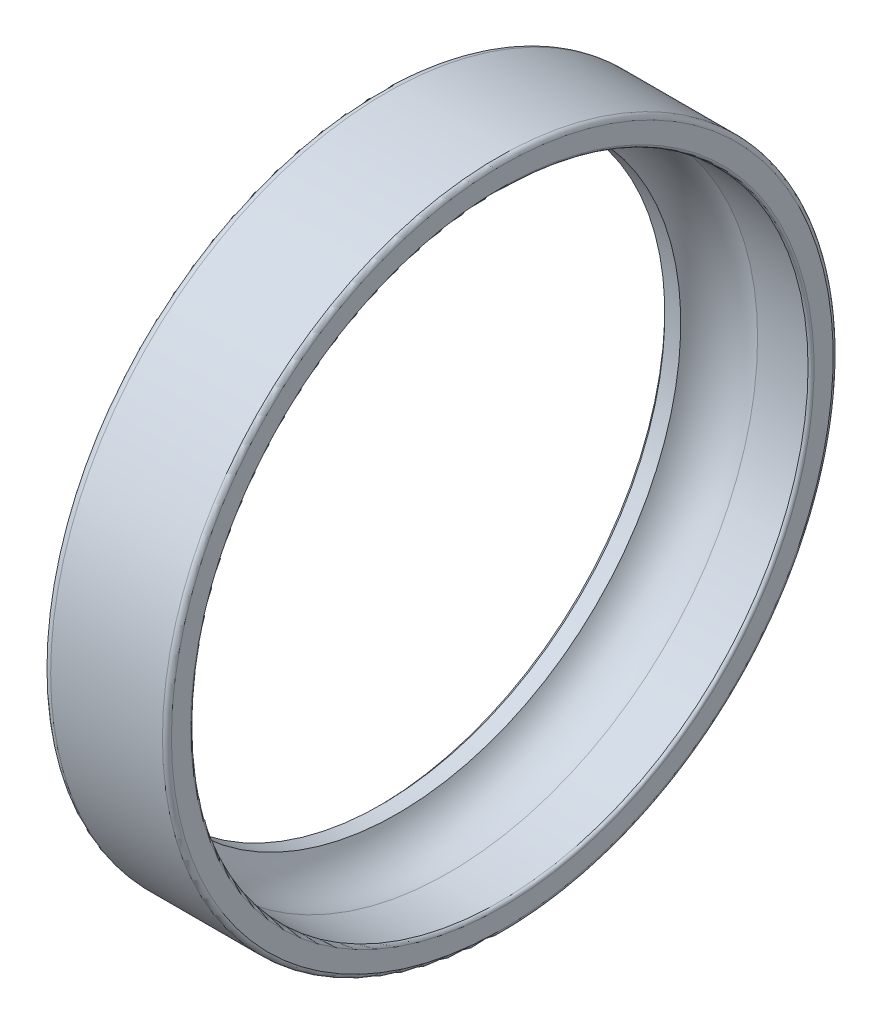
ISO-10303-21;
HEADER;
FILE_DESCRIPTION(('STEP AP214'),'2;1');
FILE_NAME('part.step','',(''),(''),'','','');
FILE_SCHEMA(('AUTOMOTIVE_DESIGN { 1 0 10303 214 1 1 1 1 }'));
ENDSEC;
DATA;
#1=APPLICATION_CONTEXT('core data for automotive mechanical design processes');
#2=APPLICATION_PROTOCOL_DEFINITION('international standard','automotive_design',2000,#1);
#3=PRODUCT_CONTEXT('',#1,'mechanical');
#4=PRODUCT('Part','Part','',(#3));
#5=PRODUCT_RELATED_PRODUCT_CATEGORY('part','',(#4));
#6=PRODUCT_DEFINITION_FORMATION('','',#4);
#7=PRODUCT_DEFINITION_CONTEXT('part definition',#1,'design');
#8=PRODUCT_DEFINITION('design','',#6,#7);
#9=PRODUCT_DEFINITION_SHAPE('','',#8);
#10=(LENGTH_UNIT() NAMED_UNIT(*) SI_UNIT(.MILLI.,.METRE.));
#11=(NAMED_UNIT(*) PLANE_ANGLE_UNIT() SI_UNIT($,.RADIAN.));
#12=(NAMED_UNIT(*) SI_UNIT($,.STERADIAN.) SOLID_ANGLE_UNIT());
#13=UNCERTAINTY_MEASURE_WITH_UNIT(LENGTH_MEASURE(1.E-05),#10,'distance_accuracy_value','');
#14=(GEOMETRIC_REPRESENTATION_CONTEXT(3) GLOBAL_UNCERTAINTY_ASSIGNED_CONTEXT((#13)) GLOBAL_UNIT_ASSIGNED_CONTEXT((#10,
#11,#12)) REPRESENTATION_CONTEXT('',''));
#15=CARTESIAN_POINT('',(0.,0.,0.));
#16=DIRECTION('',(0.,0.,1.));
#17=DIRECTION('',(1.,0.,0.));
#18=AXIS2_PLACEMENT_3D('',#15,#16,#17);
#19=CARTESIAN_POINT('',(0.,73.,0.));
#20=DIRECTION('',(1.,0.,0.));
#21=DIRECTION('',(0.,0.,-1.));
#22=AXIS2_PLACEMENT_3D('',#19,#20,#21);
#23=PLANE('',#22);
#24=CARTESIAN_POINT('',(0.,0.,0.));
#25=DIRECTION('',(-1.,0.,0.));
#26=DIRECTION('',(0.,0.,1.));
#27=AXIS2_PLACEMENT_3D('',#24,#25,#26);
#28=CIRCLE('',#27,64.35);
#29=CARTESIAN_POINT('',(0.,0.,64.35));
#30=VERTEX_POINT('',#29);
#31=EDGE_CURVE('E65',#30,#30,#28,.T.);
#32=ORIENTED_EDGE('',*,*,#31,.F.);
#33=EDGE_LOOP('',(#32));
#34=FACE_BOUND('',#33,.T.);
#35=CARTESIAN_POINT('',(0.,0.,0.));
#36=DIRECTION('',(-1.,0.,0.));
#37=DIRECTION('',(0.,0.,1.));
#38=AXIS2_PLACEMENT_3D('',#35,#36,#37);
#39=CIRCLE('',#38,73.);
#40=CARTESIAN_POINT('',(0.,0.,73.));
#41=VERTEX_POINT('',#40);
#42=EDGE_CURVE('E10',#41,#41,#39,.T.);
#43=ORIENTED_EDGE('',*,*,#42,.T.);
#44=EDGE_LOOP('',(#43));
#45=FACE_BOUND('',#44,.T.);
#46=ADVANCED_FACE('F31',(#34,#45),#23,.F.);
#47=CARTESIAN_POINT('',(2.00000000000014,0.,0.));
#48=DIRECTION('',(-1.,0.,0.));
#49=DIRECTION('',(0.,0.,1.));
#50=AXIS2_PLACEMENT_3D('',#47,#48,#49);
#51=TOROIDAL_SURFACE('',#50,72.9999999999999,2.00000000000014);
#52=ORIENTED_EDGE('',*,*,#42,.F.);
#53=EDGE_LOOP('',(#52));
#54=FACE_BOUND('',#53,.T.);
#55=CARTESIAN_POINT('',(2.,0.,0.));
#56=DIRECTION('',(-1.,0.,0.));
#57=DIRECTION('',(0.,0.,1.));
#58=AXIS2_PLACEMENT_3D('',#55,#56,#57);
#59=CIRCLE('',#58,75.);
#60=CARTESIAN_POINT('',(2.,0.,75.));
#61=VERTEX_POINT('',#60);
#62=EDGE_CURVE('E37',#61,#61,#59,.T.);
#63=ORIENTED_EDGE('',*,*,#62,.T.);
#64=EDGE_LOOP('',(#63));
#65=FACE_BOUND('',#64,.T.);
#66=ADVANCED_FACE('F72',(#54,#65),#51,.T.);
#67=CARTESIAN_POINT('',(28.,0.,0.));
#68=DIRECTION('',(-1.,0.,0.));
#69=DIRECTION('',(0.,0.,1.));
#70=AXIS2_PLACEMENT_3D('',#67,#68,#69);
#71=CYLINDRICAL_SURFACE('',#70,75.);
#72=ORIENTED_EDGE('',*,*,#62,.F.);
#73=EDGE_LOOP('',(#72));
#74=FACE_BOUND('',#73,.T.);
#75=CARTESIAN_POINT('',(27.,0.,0.));
#76=DIRECTION('',(-1.,0.,0.));
#77=DIRECTION('',(0.,0.,1.));
#78=AXIS2_PLACEMENT_3D('',#75,#76,#77);
#79=CIRCLE('',#78,75.);
#80=CARTESIAN_POINT('',(27.,0.,75.));
#81=VERTEX_POINT('',#80);
#82=EDGE_CURVE('E41',#81,#81,#79,.T.);
#83=ORIENTED_EDGE('',*,*,#82,.T.);
#84=EDGE_LOOP('',(#83));
#85=FACE_BOUND('',#84,.T.);
#86=ADVANCED_FACE('F76',(#74,#85),#71,.T.);
#87=CARTESIAN_POINT('',(27.0000000000015,0.,0.));
#88=DIRECTION('',(-1.,0.,0.));
#89=DIRECTION('',(0.,0.,1.));
#90=AXIS2_PLACEMENT_3D('',#87,#88,#89);
#91=TOROIDAL_SURFACE('',#90,74.0000000000015,0.999999999998459);
#92=ORIENTED_EDGE('',*,*,#82,.F.);
#93=EDGE_LOOP('',(#92));
#94=FACE_BOUND('',#93,.T.);
#95=CARTESIAN_POINT('',(28.,0.,0.));
#96=DIRECTION('',(-1.,0.,0.));
#97=DIRECTION('',(0.,0.,1.));
#98=AXIS2_PLACEMENT_3D('',#95,#96,#97);
#99=CIRCLE('',#98,74.);
#100=CARTESIAN_POINT('',(28.,0.,74.));
#101=VERTEX_POINT('',#100);
#102=EDGE_CURVE('E45',#101,#101,#99,.T.);
#103=ORIENTED_EDGE('',*,*,#102,.T.);
#104=EDGE_LOOP('',(#103));
#105=FACE_BOUND('',#104,.T.);
#106=ADVANCED_FACE('F81',(#94,#105),#91,.T.);
#107=CARTESIAN_POINT('',(28.,69.716666666667,0.));
#108=DIRECTION('',(-1.,0.,0.));
#109=DIRECTION('',(0.,0.,1.));
#110=AXIS2_PLACEMENT_3D('',#107,#108,#109);
#111=PLANE('',#110);
#112=ORIENTED_EDGE('',*,*,#102,.F.);
#113=EDGE_LOOP('',(#112));
#114=FACE_BOUND('',#113,.T.);
#115=CARTESIAN_POINT('',(28.,0.,0.));
#116=DIRECTION('',(-1.,0.,0.));
#117=DIRECTION('',(0.,0.,1.));
#118=AXIS2_PLACEMENT_3D('',#115,#116,#117);
#119=CIRCLE('',#118,69.716666666667);
#120=CARTESIAN_POINT('',(28.,0.,69.716666666667));
#121=VERTEX_POINT('',#120);
#122=EDGE_CURVE('E50',#121,#121,#119,.T.);
#123=ORIENTED_EDGE('',*,*,#122,.T.);
#124=EDGE_LOOP('',(#123));
#125=FACE_BOUND('',#124,.T.);
#126=ADVANCED_FACE('F87',(#114,#125),#111,.F.);
#127=CARTESIAN_POINT('',(27.3333333333321,0.,0.));
#128=DIRECTION('',(-1.,0.,0.));
#129=DIRECTION('',(0.,0.,1.));
#130=AXIS2_PLACEMENT_3D('',#127,#128,#129);
#131=TOROIDAL_SURFACE('',#130,69.7166666666679,0.666666666667898);
#132=ORIENTED_EDGE('',*,*,#122,.F.);
#133=EDGE_LOOP('',(#132));
#134=FACE_BOUND('',#133,.T.);
#135=CARTESIAN_POINT('',(27.333333333333,0.,0.));
#136=DIRECTION('',(-1.,0.,0.));
#137=DIRECTION('',(0.,0.,1.));
#138=AXIS2_PLACEMENT_3D('',#135,#136,#137);
#139=CIRCLE('',#138,69.05);
#140=CARTESIAN_POINT('',(27.333333333333,0.,69.05));
#141=VERTEX_POINT('',#140);
#142=EDGE_CURVE('E53',#141,#141,#139,.T.);
#143=ORIENTED_EDGE('',*,*,#142,.T.);
#144=EDGE_LOOP('',(#143));
#145=FACE_BOUND('',#144,.T.);
#146=ADVANCED_FACE('F91',(#134,#145),#131,.T.);
#147=CARTESIAN_POINT('',(28.,0.,0.));
#148=DIRECTION('',(-1.,0.,0.));
#149=DIRECTION('',(0.,0.,1.));
#150=AXIS2_PLACEMENT_3D('',#147,#148,#149);
#151=CYLINDRICAL_SURFACE('',#150,69.05);
#152=ORIENTED_EDGE('',*,*,#142,.F.);
#153=EDGE_LOOP('',(#152));
#154=FACE_BOUND('',#153,.T.);
#155=CARTESIAN_POINT('',(16.039607805437,0.,0.));
#156=DIRECTION('',(-1.,0.,0.));
#157=DIRECTION('',(0.,0.,1.));
#158=AXIS2_PLACEMENT_3D('',#155,#156,#157);
#159=CIRCLE('',#158,69.05);
#160=CARTESIAN_POINT('',(16.039607805437,0.,69.05));
#161=VERTEX_POINT('',#160);
#162=EDGE_CURVE('E56',#161,#161,#159,.T.);
#163=ORIENTED_EDGE('',*,*,#162,.T.);
#164=EDGE_LOOP('',(#163));
#165=FACE_BOUND('',#164,.T.);
#166=ADVANCED_FACE('F95',(#154,#165),#151,.F.);
#167=CARTESIAN_POINT('',(14.0000000000006,0.,0.));
#168=DIRECTION('',(-1.,0.,0.));
#169=DIRECTION('',(0.,0.,1.));
#170=AXIS2_PLACEMENT_3D('',#167,#168,#169);
#171=TOROIDAL_SURFACE('',#170,58.7499999999988,10.5000000000011);
#172=ORIENTED_EDGE('',*,*,#162,.F.);
#173=EDGE_LOOP('',(#172));
#174=FACE_BOUND('',#173,.T.);
#175=CARTESIAN_POINT('',(4.5612500827705,0.,0.));
#176=DIRECTION('',(-1.,0.,0.));
#177=DIRECTION('',(0.,0.,1.));
#178=AXIS2_PLACEMENT_3D('',#175,#176,#177);
#179=CIRCLE('',#178,63.35);
#180=CARTESIAN_POINT('',(4.5612500827705,0.,63.35));
#181=VERTEX_POINT('',#180);
#182=EDGE_CURVE('E59',#181,#181,#179,.T.);
#183=ORIENTED_EDGE('',*,*,#182,.T.);
#184=EDGE_LOOP('',(#183));
#185=FACE_BOUND('',#184,.T.);
#186=ADVANCED_FACE('F99',(#174,#185),#171,.F.);
#187=CARTESIAN_POINT('',(28.,0.,0.));
#188=DIRECTION('',(-1.,0.,0.));
#189=DIRECTION('',(0.,0.,1.));
#190=AXIS2_PLACEMENT_3D('',#187,#188,#189);
#191=CYLINDRICAL_SURFACE('',#190,63.35);
#192=ORIENTED_EDGE('',*,*,#182,.F.);
#193=EDGE_LOOP('',(#192));
#194=FACE_BOUND('',#193,.T.);
#195=CARTESIAN_POINT('',(1.,0.,0.));
#196=DIRECTION('',(-1.,0.,0.));
#197=DIRECTION('',(0.,0.,1.));
#198=AXIS2_PLACEMENT_3D('',#195,#196,#197);
#199=CIRCLE('',#198,63.35);
#200=CARTESIAN_POINT('',(1.,0.,63.35));
#201=VERTEX_POINT('',#200);
#202=EDGE_CURVE('E62',#201,#201,#199,.T.);
#203=ORIENTED_EDGE('',*,*,#202,.T.);
#204=EDGE_LOOP('',(#203));
#205=FACE_BOUND('',#204,.T.);
#206=ADVANCED_FACE('F103',(#194,#205),#191,.F.);
#207=CARTESIAN_POINT('',(0.,0.,0.));
#208=DIRECTION('',(-1.,0.,0.));
#209=DIRECTION('',(0.,0.,1.));
#210=AXIS2_PLACEMENT_3D('',#207,#208,#209);
#211=CONICAL_SURFACE('',#210,64.35,0.785398163397448);
#212=ORIENTED_EDGE('',*,*,#202,.F.);
#213=EDGE_LOOP('',(#212));
#214=FACE_BOUND('',#213,.T.);
#215=ORIENTED_EDGE('',*,*,#31,.T.);
#216=EDGE_LOOP('',(#215));
#217=FACE_BOUND('',#216,.T.);
#218=ADVANCED_FACE('F69',(#214,#217),#211,.F.);
#219=CLOSED_SHELL('',(#46,#66,#86,#106,#126,#146,#166,#186,#206,#218));
#220=MANIFOLD_SOLID_BREP('B2',#219);
#221=ADVANCED_BREP_SHAPE_REPRESENTATION('',(#18,#220),#14);
#222=SHAPE_DEFINITION_REPRESENTATION(#9,#221);
ENDSEC;
END-ISO-10303-21;
